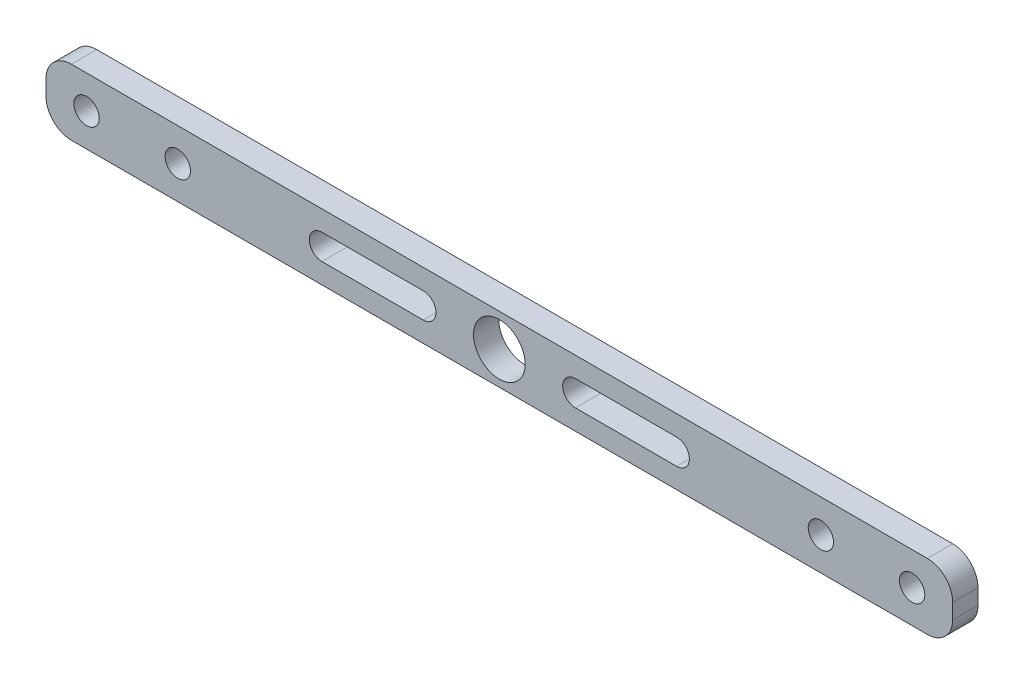
ISO-10303-21;
HEADER;
FILE_DESCRIPTION(('STEP AP214'),'2;1');
FILE_NAME('part.step','',(''),(''),'','','');
FILE_SCHEMA(('AUTOMOTIVE_DESIGN { 1 0 10303 214 1 1 1 1 }'));
ENDSEC;
DATA;
#1=APPLICATION_CONTEXT('core data for automotive mechanical design processes');
#2=APPLICATION_PROTOCOL_DEFINITION('international standard','automotive_design',2000,#1);
#3=PRODUCT_CONTEXT('',#1,'mechanical');
#4=PRODUCT('Part','Part','',(#3));
#5=PRODUCT_RELATED_PRODUCT_CATEGORY('part','',(#4));
#6=PRODUCT_DEFINITION_FORMATION('','',#4);
#7=PRODUCT_DEFINITION_CONTEXT('part definition',#1,'design');
#8=PRODUCT_DEFINITION('design','',#6,#7);
#9=PRODUCT_DEFINITION_SHAPE('','',#8);
#10=(LENGTH_UNIT() NAMED_UNIT(*) SI_UNIT(.MILLI.,.METRE.));
#11=(NAMED_UNIT(*) PLANE_ANGLE_UNIT() SI_UNIT($,.RADIAN.));
#12=(NAMED_UNIT(*) SI_UNIT($,.STERADIAN.) SOLID_ANGLE_UNIT());
#13=UNCERTAINTY_MEASURE_WITH_UNIT(LENGTH_MEASURE(1.E-05),#10,'distance_accuracy_value','');
#14=(GEOMETRIC_REPRESENTATION_CONTEXT(3) GLOBAL_UNCERTAINTY_ASSIGNED_CONTEXT((#13)) GLOBAL_UNIT_ASSIGNED_CONTEXT((#10,
#11,#12)) REPRESENTATION_CONTEXT('',''));
#15=CARTESIAN_POINT('',(0.,0.,0.));
#16=DIRECTION('',(0.,0.,1.));
#17=DIRECTION('',(1.,0.,0.));
#18=AXIS2_PLACEMENT_3D('',#15,#16,#17);
#19=CARTESIAN_POINT('',(84.445,1.5,5.));
#20=DIRECTION('',(0.,0.,-1.));
#21=DIRECTION('',(-1.,0.,0.));
#22=AXIS2_PLACEMENT_3D('',#19,#20,#21);
#23=PLANE('',#22);
#24=CARTESIAN_POINT('',(-81.445,0.,5.));
#25=DIRECTION('',(0.,0.,1.));
#26=DIRECTION('',(1.,0.,0.));
#27=AXIS2_PLACEMENT_3D('',#24,#25,#26);
#28=CIRCLE('',#27,2.49999999999999);
#29=CARTESIAN_POINT('',(-78.945,0.,5.));
#30=VERTEX_POINT('',#29);
#31=EDGE_CURVE('E203',#30,#30,#28,.T.);
#32=ORIENTED_EDGE('',*,*,#31,.F.);
#33=EDGE_LOOP('',(#32));
#34=FACE_BOUND('',#33,.T.);
#35=DIRECTION('',(-1.,0.,0.));
#36=VECTOR('',#35,1.);
#37=CARTESIAN_POINT('',(-15.,2.5,5.));
#38=LINE('',#37,#36);
#39=CARTESIAN_POINT('',(-15.,2.5,5.));
#40=VERTEX_POINT('',#39);
#41=CARTESIAN_POINT('',(-35.,2.5,5.));
#42=VERTEX_POINT('',#41);
#43=EDGE_CURVE('E173',#40,#42,#38,.T.);
#44=ORIENTED_EDGE('',*,*,#43,.F.);
#45=CARTESIAN_POINT('',(-15.,0.,5.));
#46=DIRECTION('',(0.,0.,1.));
#47=DIRECTION('',(-1.,0.,0.));
#48=AXIS2_PLACEMENT_3D('',#45,#46,#47);
#49=CIRCLE('',#48,2.5);
#50=CARTESIAN_POINT('',(-15.,-2.5,5.));
#51=VERTEX_POINT('',#50);
#52=EDGE_CURVE('E55',#51,#40,#49,.T.);
#53=ORIENTED_EDGE('',*,*,#52,.F.);
#54=DIRECTION('',(1.,0.,0.));
#55=VECTOR('',#54,1.);
#56=CARTESIAN_POINT('',(-15.,-2.5,5.));
#57=LINE('',#56,#55);
#58=CARTESIAN_POINT('',(-35.,-2.5,5.));
#59=VERTEX_POINT('',#58);
#60=EDGE_CURVE('E161',#59,#51,#57,.T.);
#61=ORIENTED_EDGE('',*,*,#60,.F.);
#62=CARTESIAN_POINT('',(-35.,0.,5.));
#63=DIRECTION('',(0.,0.,1.));
#64=DIRECTION('',(-1.,0.,0.));
#65=AXIS2_PLACEMENT_3D('',#62,#63,#64);
#66=CIRCLE('',#65,2.5);
#67=EDGE_CURVE('E167',#42,#59,#66,.T.);
#68=ORIENTED_EDGE('',*,*,#67,.F.);
#69=EDGE_LOOP('',(#44,#53,#61,#68));
#70=FACE_BOUND('',#69,.T.);
#71=CARTESIAN_POINT('',(-63.445,0.,5.));
#72=DIRECTION('',(0.,0.,1.));
#73=DIRECTION('',(1.,0.,0.));
#74=AXIS2_PLACEMENT_3D('',#71,#72,#73);
#75=CIRCLE('',#74,2.49999999999999);
#76=CARTESIAN_POINT('',(-60.945,0.,5.));
#77=VERTEX_POINT('',#76);
#78=EDGE_CURVE('E200',#77,#77,#75,.T.);
#79=ORIENTED_EDGE('',*,*,#78,.F.);
#80=EDGE_LOOP('',(#79));
#81=FACE_BOUND('',#80,.T.);
#82=CARTESIAN_POINT('',(63.445,0.,5.));
#83=DIRECTION('',(0.,0.,1.));
#84=DIRECTION('',(-1.,0.,0.));
#85=AXIS2_PLACEMENT_3D('',#82,#83,#84);
#86=CIRCLE('',#85,2.49999999999999);
#87=CARTESIAN_POINT('',(60.945,0.,5.));
#88=VERTEX_POINT('',#87);
#89=EDGE_CURVE('E184',#88,#88,#86,.T.);
#90=ORIENTED_EDGE('',*,*,#89,.F.);
#91=EDGE_LOOP('',(#90));
#92=FACE_BOUND('',#91,.T.);
#93=CARTESIAN_POINT('',(81.445,0.,5.));
#94=DIRECTION('',(0.,0.,1.));
#95=DIRECTION('',(-1.,0.,0.));
#96=AXIS2_PLACEMENT_3D('',#93,#94,#95);
#97=CIRCLE('',#96,2.49999999999999);
#98=CARTESIAN_POINT('',(78.945,0.,5.));
#99=VERTEX_POINT('',#98);
#100=EDGE_CURVE('E181',#99,#99,#97,.T.);
#101=ORIENTED_EDGE('',*,*,#100,.F.);
#102=EDGE_LOOP('',(#101));
#103=FACE_BOUND('',#102,.T.);
#104=DIRECTION('',(1.,0.,0.));
#105=VECTOR('',#104,1.);
#106=CARTESIAN_POINT('',(15.,-2.5,5.));
#107=LINE('',#106,#105);
#108=CARTESIAN_POINT('',(15.,-2.5,5.));
#109=VERTEX_POINT('',#108);
#110=CARTESIAN_POINT('',(35.,-2.5,5.));
#111=VERTEX_POINT('',#110);
#112=EDGE_CURVE('E196',#109,#111,#107,.T.);
#113=ORIENTED_EDGE('',*,*,#112,.F.);
#114=CARTESIAN_POINT('',(15.,0.,5.));
#115=DIRECTION('',(0.,0.,1.));
#116=DIRECTION('',(1.,0.,0.));
#117=AXIS2_PLACEMENT_3D('',#114,#115,#116);
#118=CIRCLE('',#117,2.5);
#119=CARTESIAN_POINT('',(15.,2.5,5.));
#120=VERTEX_POINT('',#119);
#121=EDGE_CURVE('E63',#120,#109,#118,.T.);
#122=ORIENTED_EDGE('',*,*,#121,.F.);
#123=DIRECTION('',(-1.,0.,0.));
#124=VECTOR('',#123,1.);
#125=CARTESIAN_POINT('',(15.,2.5,5.));
#126=LINE('',#125,#124);
#127=CARTESIAN_POINT('',(35.,2.5,5.));
#128=VERTEX_POINT('',#127);
#129=EDGE_CURVE('E187',#128,#120,#126,.T.);
#130=ORIENTED_EDGE('',*,*,#129,.F.);
#131=CARTESIAN_POINT('',(35.,0.,5.));
#132=DIRECTION('',(0.,0.,1.));
#133=DIRECTION('',(1.,0.,0.));
#134=AXIS2_PLACEMENT_3D('',#131,#132,#133);
#135=CIRCLE('',#134,2.5);
#136=EDGE_CURVE('E193',#111,#128,#135,.T.);
#137=ORIENTED_EDGE('',*,*,#136,.F.);
#138=EDGE_LOOP('',(#113,#122,#130,#137));
#139=FACE_BOUND('',#138,.T.);
#140=CARTESIAN_POINT('',(84.445,1.5,5.));
#141=DIRECTION('',(0.,0.,1.));
#142=DIRECTION('',(-1.,0.,0.));
#143=AXIS2_PLACEMENT_3D('',#140,#141,#142);
#144=CIRCLE('',#143,5.00000000000001);
#145=CARTESIAN_POINT('',(89.445,1.5,5.));
#146=VERTEX_POINT('',#145);
#147=CARTESIAN_POINT('',(84.445,6.5,5.));
#148=VERTEX_POINT('',#147);
#149=EDGE_CURVE('E213',#146,#148,#144,.T.);
#150=ORIENTED_EDGE('',*,*,#149,.T.);
#151=DIRECTION('',(-1.,0.,0.));
#152=VECTOR('',#151,1.);
#153=CARTESIAN_POINT('',(-84.445,6.5,5.));
#154=LINE('',#153,#152);
#155=CARTESIAN_POINT('',(-84.445,6.5,5.));
#156=VERTEX_POINT('',#155);
#157=EDGE_CURVE('E216',#148,#156,#154,.T.);
#158=ORIENTED_EDGE('',*,*,#157,.T.);
#159=CARTESIAN_POINT('',(-84.445,1.5,5.));
#160=DIRECTION('',(0.,0.,1.));
#161=DIRECTION('',(1.,0.,0.));
#162=AXIS2_PLACEMENT_3D('',#159,#160,#161);
#163=CIRCLE('',#162,5.);
#164=CARTESIAN_POINT('',(-89.445,1.5,5.));
#165=VERTEX_POINT('',#164);
#166=EDGE_CURVE('E219',#156,#165,#163,.T.);
#167=ORIENTED_EDGE('',*,*,#166,.T.);
#168=DIRECTION('',(0.,-1.,0.));
#169=VECTOR('',#168,1.);
#170=CARTESIAN_POINT('',(-89.445,1.5,5.));
#171=LINE('',#170,#169);
#172=CARTESIAN_POINT('',(-89.445,-1.5,5.));
#173=VERTEX_POINT('',#172);
#174=EDGE_CURVE('E221',#165,#173,#171,.T.);
#175=ORIENTED_EDGE('',*,*,#174,.T.);
#176=CARTESIAN_POINT('',(-84.445,-1.5,5.));
#177=DIRECTION('',(0.,0.,1.));
#178=DIRECTION('',(1.,0.,0.));
#179=AXIS2_PLACEMENT_3D('',#176,#177,#178);
#180=CIRCLE('',#179,5.);
#181=CARTESIAN_POINT('',(-84.445,-6.49999999999999,5.));
#182=VERTEX_POINT('',#181);
#183=EDGE_CURVE('E223',#173,#182,#180,.T.);
#184=ORIENTED_EDGE('',*,*,#183,.T.);
#185=DIRECTION('',(1.,0.,0.));
#186=VECTOR('',#185,1.);
#187=CARTESIAN_POINT('',(-84.445,-6.5,5.));
#188=LINE('',#187,#186);
#189=CARTESIAN_POINT('',(84.445,-6.5,5.));
#190=VERTEX_POINT('',#189);
#191=EDGE_CURVE('E225',#182,#190,#188,.T.);
#192=ORIENTED_EDGE('',*,*,#191,.T.);
#193=CARTESIAN_POINT('',(84.445,-1.5,5.));
#194=DIRECTION('',(0.,0.,1.));
#195=DIRECTION('',(1.,0.,0.));
#196=AXIS2_PLACEMENT_3D('',#193,#194,#195);
#197=CIRCLE('',#196,5.00000000000001);
#198=CARTESIAN_POINT('',(89.445,-1.5,5.));
#199=VERTEX_POINT('',#198);
#200=EDGE_CURVE('E227',#190,#199,#197,.T.);
#201=ORIENTED_EDGE('',*,*,#200,.T.);
#202=DIRECTION('',(0.,1.,0.));
#203=VECTOR('',#202,1.);
#204=CARTESIAN_POINT('',(89.445,1.5,5.));
#205=LINE('',#204,#203);
#206=EDGE_CURVE('E229',#199,#146,#205,.T.);
#207=ORIENTED_EDGE('',*,*,#206,.T.);
#208=EDGE_LOOP('',(#150,#158,#167,#175,#184,#192,#201,#207));
#209=FACE_BOUND('',#208,.T.);
#210=CARTESIAN_POINT('',(0.,0.,5.));
#211=DIRECTION('',(0.,0.,1.));
#212=DIRECTION('',(1.,0.,0.));
#213=AXIS2_PLACEMENT_3D('',#210,#211,#212);
#214=CIRCLE('',#213,5.0999999999999);
#215=CARTESIAN_POINT('',(5.09999999999998,0.,5.));
#216=VERTEX_POINT('',#215);
#217=EDGE_CURVE('E206',#216,#216,#214,.T.);
#218=ORIENTED_EDGE('',*,*,#217,.F.);
#219=EDGE_LOOP('',(#218));
#220=FACE_BOUND('',#219,.T.);
#221=ADVANCED_FACE('F39',(#34,#70,#81,#92,#103,#139,#209,#220),#23,.F.);
#222=CARTESIAN_POINT('',(84.445,1.5,0.));
#223=DIRECTION('',(0.,0.,-1.));
#224=DIRECTION('',(-1.,0.,0.));
#225=AXIS2_PLACEMENT_3D('',#222,#223,#224);
#226=PLANE('',#225);
#227=CARTESIAN_POINT('',(-81.445,0.,0.));
#228=DIRECTION('',(0.,0.,-1.));
#229=DIRECTION('',(-1.,0.,0.));
#230=AXIS2_PLACEMENT_3D('',#227,#228,#229);
#231=CIRCLE('',#230,2.49999999999999);
#232=CARTESIAN_POINT('',(-83.945,0.,0.));
#233=VERTEX_POINT('',#232);
#234=EDGE_CURVE('E43',#233,#233,#231,.T.);
#235=ORIENTED_EDGE('',*,*,#234,.F.);
#236=EDGE_LOOP('',(#235));
#237=FACE_BOUND('',#236,.T.);
#238=CARTESIAN_POINT('',(-15.,0.,0.));
#239=DIRECTION('',(0.,0.,-1.));
#240=DIRECTION('',(-1.,0.,0.));
#241=AXIS2_PLACEMENT_3D('',#238,#239,#240);
#242=CIRCLE('',#241,2.5);
#243=CARTESIAN_POINT('',(-15.,2.5,0.));
#244=VERTEX_POINT('',#243);
#245=CARTESIAN_POINT('',(-15.,-2.5,0.));
#246=VERTEX_POINT('',#245);
#247=EDGE_CURVE('E11',#244,#246,#242,.T.);
#248=ORIENTED_EDGE('',*,*,#247,.F.);
#249=DIRECTION('',(1.,0.,0.));
#250=VECTOR('',#249,1.);
#251=CARTESIAN_POINT('',(84.445,2.49999999999998,0.));
#252=LINE('',#251,#250);
#253=CARTESIAN_POINT('',(-35.,2.5,0.));
#254=VERTEX_POINT('',#253);
#255=EDGE_CURVE('E279',#254,#244,#252,.T.);
#256=ORIENTED_EDGE('',*,*,#255,.F.);
#257=CARTESIAN_POINT('',(-35.,0.,0.));
#258=DIRECTION('',(0.,0.,-1.));
#259=DIRECTION('',(-1.,0.,0.));
#260=AXIS2_PLACEMENT_3D('',#257,#258,#259);
#261=CIRCLE('',#260,2.5);
#262=CARTESIAN_POINT('',(-35.,-2.5,0.));
#263=VERTEX_POINT('',#262);
#264=EDGE_CURVE('E290',#263,#254,#261,.T.);
#265=ORIENTED_EDGE('',*,*,#264,.F.);
#266=DIRECTION('',(-1.,0.,0.));
#267=VECTOR('',#266,1.);
#268=CARTESIAN_POINT('',(84.445,-2.50000000000001,0.));
#269=LINE('',#268,#267);
#270=EDGE_CURVE('E48',#246,#263,#269,.T.);
#271=ORIENTED_EDGE('',*,*,#270,.F.);
#272=EDGE_LOOP('',(#248,#256,#265,#271));
#273=FACE_BOUND('',#272,.T.);
#274=CARTESIAN_POINT('',(-63.445,0.,0.));
#275=DIRECTION('',(0.,0.,-1.));
#276=DIRECTION('',(-1.,0.,0.));
#277=AXIS2_PLACEMENT_3D('',#274,#275,#276);
#278=CIRCLE('',#277,2.49999999999999);
#279=CARTESIAN_POINT('',(-65.945,0.,0.));
#280=VERTEX_POINT('',#279);
#281=EDGE_CURVE('E286',#280,#280,#278,.T.);
#282=ORIENTED_EDGE('',*,*,#281,.F.);
#283=EDGE_LOOP('',(#282));
#284=FACE_BOUND('',#283,.T.);
#285=CARTESIAN_POINT('',(63.445,0.,0.));
#286=DIRECTION('',(0.,0.,-1.));
#287=DIRECTION('',(-1.,0.,0.));
#288=AXIS2_PLACEMENT_3D('',#285,#286,#287);
#289=CIRCLE('',#288,2.49999999999999);
#290=CARTESIAN_POINT('',(60.945,0.,0.));
#291=VERTEX_POINT('',#290);
#292=EDGE_CURVE('E283',#291,#291,#289,.T.);
#293=ORIENTED_EDGE('',*,*,#292,.F.);
#294=EDGE_LOOP('',(#293));
#295=FACE_BOUND('',#294,.T.);
#296=CARTESIAN_POINT('',(81.445,0.,0.));
#297=DIRECTION('',(0.,0.,-1.));
#298=DIRECTION('',(-1.,0.,0.));
#299=AXIS2_PLACEMENT_3D('',#296,#297,#298);
#300=CIRCLE('',#299,2.49999999999999);
#301=CARTESIAN_POINT('',(78.945,0.,0.));
#302=VERTEX_POINT('',#301);
#303=EDGE_CURVE('E280',#302,#302,#300,.T.);
#304=ORIENTED_EDGE('',*,*,#303,.F.);
#305=EDGE_LOOP('',(#304));
#306=FACE_BOUND('',#305,.T.);
#307=CARTESIAN_POINT('',(15.,0.,0.));
#308=DIRECTION('',(0.,0.,-1.));
#309=DIRECTION('',(-1.,0.,0.));
#310=AXIS2_PLACEMENT_3D('',#307,#308,#309);
#311=CIRCLE('',#310,2.5);
#312=CARTESIAN_POINT('',(15.,-2.5,0.));
#313=VERTEX_POINT('',#312);
#314=CARTESIAN_POINT('',(15.,2.5,0.));
#315=VERTEX_POINT('',#314);
#316=EDGE_CURVE('E277',#313,#315,#311,.T.);
#317=ORIENTED_EDGE('',*,*,#316,.F.);
#318=DIRECTION('',(-1.,0.,0.));
#319=VECTOR('',#318,1.);
#320=CARTESIAN_POINT('',(84.445,-2.49999999999998,0.));
#321=LINE('',#320,#319);
#322=CARTESIAN_POINT('',(35.,-2.49999999999999,0.));
#323=VERTEX_POINT('',#322);
#324=EDGE_CURVE('E270',#323,#313,#321,.T.);
#325=ORIENTED_EDGE('',*,*,#324,.F.);
#326=CARTESIAN_POINT('',(35.,0.,0.));
#327=DIRECTION('',(0.,0.,-1.));
#328=DIRECTION('',(-1.,0.,0.));
#329=AXIS2_PLACEMENT_3D('',#326,#327,#328);
#330=CIRCLE('',#329,2.5);
#331=CARTESIAN_POINT('',(35.,2.5,0.));
#332=VERTEX_POINT('',#331);
#333=EDGE_CURVE('E272',#332,#323,#330,.T.);
#334=ORIENTED_EDGE('',*,*,#333,.F.);
#335=DIRECTION('',(1.,0.,0.));
#336=VECTOR('',#335,1.);
#337=CARTESIAN_POINT('',(84.445,2.50000000000001,0.));
#338=LINE('',#337,#336);
#339=EDGE_CURVE('E275',#315,#332,#338,.T.);
#340=ORIENTED_EDGE('',*,*,#339,.F.);
#341=EDGE_LOOP('',(#317,#325,#334,#340));
#342=FACE_BOUND('',#341,.T.);
#343=CARTESIAN_POINT('',(84.445,1.5,0.));
#344=DIRECTION('',(0.,0.,1.));
#345=DIRECTION('',(-1.,0.,0.));
#346=AXIS2_PLACEMENT_3D('',#343,#344,#345);
#347=CIRCLE('',#346,5.00000000000001);
#348=CARTESIAN_POINT('',(89.445,1.5,0.));
#349=VERTEX_POINT('',#348);
#350=CARTESIAN_POINT('',(84.445,6.5,0.));
#351=VERTEX_POINT('',#350);
#352=EDGE_CURVE('E209',#349,#351,#347,.T.);
#353=ORIENTED_EDGE('',*,*,#352,.F.);
#354=DIRECTION('',(0.,1.,0.));
#355=VECTOR('',#354,1.);
#356=CARTESIAN_POINT('',(89.445,1.5,0.));
#357=LINE('',#356,#355);
#358=CARTESIAN_POINT('',(89.445,-1.5,0.));
#359=VERTEX_POINT('',#358);
#360=EDGE_CURVE('E217',#359,#349,#357,.T.);
#361=ORIENTED_EDGE('',*,*,#360,.F.);
#362=CARTESIAN_POINT('',(84.445,-1.5,0.));
#363=DIRECTION('',(0.,0.,1.));
#364=DIRECTION('',(1.,0.,0.));
#365=AXIS2_PLACEMENT_3D('',#362,#363,#364);
#366=CIRCLE('',#365,5.00000000000001);
#367=CARTESIAN_POINT('',(84.445,-6.5,0.));
#368=VERTEX_POINT('',#367);
#369=EDGE_CURVE('E244',#368,#359,#366,.T.);
#370=ORIENTED_EDGE('',*,*,#369,.F.);
#371=DIRECTION('',(1.,0.,0.));
#372=VECTOR('',#371,1.);
#373=CARTESIAN_POINT('',(-84.445,-6.5,0.));
#374=LINE('',#373,#372);
#375=CARTESIAN_POINT('',(-84.445,-6.49999999999999,0.));
#376=VERTEX_POINT('',#375);
#377=EDGE_CURVE('E242',#376,#368,#374,.T.);
#378=ORIENTED_EDGE('',*,*,#377,.F.);
#379=CARTESIAN_POINT('',(-84.445,-1.5,0.));
#380=DIRECTION('',(0.,0.,1.));
#381=DIRECTION('',(1.,0.,0.));
#382=AXIS2_PLACEMENT_3D('',#379,#380,#381);
#383=CIRCLE('',#382,5.);
#384=CARTESIAN_POINT('',(-89.445,-1.5,0.));
#385=VERTEX_POINT('',#384);
#386=EDGE_CURVE('E240',#385,#376,#383,.T.);
#387=ORIENTED_EDGE('',*,*,#386,.F.);
#388=DIRECTION('',(0.,-1.,0.));
#389=VECTOR('',#388,1.);
#390=CARTESIAN_POINT('',(-89.445,1.5,0.));
#391=LINE('',#390,#389);
#392=CARTESIAN_POINT('',(-89.445,1.5,0.));
#393=VERTEX_POINT('',#392);
#394=EDGE_CURVE('E238',#393,#385,#391,.T.);
#395=ORIENTED_EDGE('',*,*,#394,.F.);
#396=CARTESIAN_POINT('',(-84.445,1.5,0.));
#397=DIRECTION('',(0.,0.,1.));
#398=DIRECTION('',(1.,0.,0.));
#399=AXIS2_PLACEMENT_3D('',#396,#397,#398);
#400=CIRCLE('',#399,5.);
#401=CARTESIAN_POINT('',(-84.445,6.5,0.));
#402=VERTEX_POINT('',#401);
#403=EDGE_CURVE('E236',#402,#393,#400,.T.);
#404=ORIENTED_EDGE('',*,*,#403,.F.);
#405=DIRECTION('',(-1.,0.,0.));
#406=VECTOR('',#405,1.);
#407=CARTESIAN_POINT('',(-84.445,6.5,0.));
#408=LINE('',#407,#406);
#409=EDGE_CURVE('E234',#351,#402,#408,.T.);
#410=ORIENTED_EDGE('',*,*,#409,.F.);
#411=EDGE_LOOP('',(#353,#361,#370,#378,#387,#395,#404,#410));
#412=FACE_BOUND('',#411,.T.);
#413=CARTESIAN_POINT('',(0.,0.,0.));
#414=DIRECTION('',(0.,0.,1.));
#415=DIRECTION('',(1.,0.,0.));
#416=AXIS2_PLACEMENT_3D('',#413,#414,#415);
#417=CIRCLE('',#416,5.0999999999999);
#418=CARTESIAN_POINT('',(5.09999999999998,0.,0.));
#419=VERTEX_POINT('',#418);
#420=EDGE_CURVE('E210',#419,#419,#417,.T.);
#421=ORIENTED_EDGE('',*,*,#420,.T.);
#422=EDGE_LOOP('',(#421));
#423=FACE_BOUND('',#422,.T.);
#424=ADVANCED_FACE('F300',(#237,#273,#284,#295,#306,#342,#412,#423),#226,.T.);
#425=CARTESIAN_POINT('',(84.445,1.5,5.));
#426=DIRECTION('',(0.,0.,-1.));
#427=DIRECTION('',(-1.,0.,0.));
#428=AXIS2_PLACEMENT_3D('',#425,#426,#427);
#429=CYLINDRICAL_SURFACE('',#428,5.00000000000001);
#430=ORIENTED_EDGE('',*,*,#352,.T.);
#431=DIRECTION('',(0.,0.,-1.));
#432=VECTOR('',#431,1.);
#433=CARTESIAN_POINT('',(84.445,6.5,5.));
#434=LINE('',#433,#432);
#435=EDGE_CURVE('E267',#148,#351,#434,.T.);
#436=ORIENTED_EDGE('',*,*,#435,.F.);
#437=ORIENTED_EDGE('',*,*,#149,.F.);
#438=DIRECTION('',(0.,0.,-1.));
#439=VECTOR('',#438,1.);
#440=CARTESIAN_POINT('',(89.445,1.5,5.));
#441=LINE('',#440,#439);
#442=EDGE_CURVE('E231',#146,#349,#441,.T.);
#443=ORIENTED_EDGE('',*,*,#442,.T.);
#444=EDGE_LOOP('',(#430,#436,#437,#443));
#445=FACE_BOUND('',#444,.T.);
#446=ADVANCED_FACE('F41',(#445),#429,.T.);
#447=CARTESIAN_POINT('',(-84.445,6.5,5.));
#448=DIRECTION('',(0.,-1.,0.));
#449=DIRECTION('',(0.,0.,-1.));
#450=AXIS2_PLACEMENT_3D('',#447,#448,#449);
#451=PLANE('',#450);
#452=ORIENTED_EDGE('',*,*,#409,.T.);
#453=DIRECTION('',(0.,0.,-1.));
#454=VECTOR('',#453,1.);
#455=CARTESIAN_POINT('',(-84.445,6.5,5.));
#456=LINE('',#455,#454);
#457=EDGE_CURVE('E264',#156,#402,#456,.T.);
#458=ORIENTED_EDGE('',*,*,#457,.F.);
#459=ORIENTED_EDGE('',*,*,#157,.F.);
#460=ORIENTED_EDGE('',*,*,#435,.T.);
#461=EDGE_LOOP('',(#452,#458,#459,#460));
#462=FACE_BOUND('',#461,.T.);
#463=ADVANCED_FACE('F346',(#462),#451,.F.);
#464=CARTESIAN_POINT('',(-84.445,1.5,5.));
#465=DIRECTION('',(0.,0.,-1.));
#466=DIRECTION('',(-1.,0.,0.));
#467=AXIS2_PLACEMENT_3D('',#464,#465,#466);
#468=CYLINDRICAL_SURFACE('',#467,5.);
#469=ORIENTED_EDGE('',*,*,#403,.T.);
#470=DIRECTION('',(0.,0.,-1.));
#471=VECTOR('',#470,1.);
#472=CARTESIAN_POINT('',(-89.445,1.5,5.));
#473=LINE('',#472,#471);
#474=EDGE_CURVE('E261',#165,#393,#473,.T.);
#475=ORIENTED_EDGE('',*,*,#474,.F.);
#476=ORIENTED_EDGE('',*,*,#166,.F.);
#477=ORIENTED_EDGE('',*,*,#457,.T.);
#478=EDGE_LOOP('',(#469,#475,#476,#477));
#479=FACE_BOUND('',#478,.T.);
#480=ADVANCED_FACE('F343',(#479),#468,.T.);
#481=CARTESIAN_POINT('',(-89.445,1.5,5.));
#482=DIRECTION('',(1.,0.,0.));
#483=DIRECTION('',(0.,0.,-1.));
#484=AXIS2_PLACEMENT_3D('',#481,#482,#483);
#485=PLANE('',#484);
#486=ORIENTED_EDGE('',*,*,#394,.T.);
#487=DIRECTION('',(0.,0.,-1.));
#488=VECTOR('',#487,1.);
#489=CARTESIAN_POINT('',(-89.445,-1.5,5.));
#490=LINE('',#489,#488);
#491=EDGE_CURVE('E258',#173,#385,#490,.T.);
#492=ORIENTED_EDGE('',*,*,#491,.F.);
#493=ORIENTED_EDGE('',*,*,#174,.F.);
#494=ORIENTED_EDGE('',*,*,#474,.T.);
#495=EDGE_LOOP('',(#486,#492,#493,#494));
#496=FACE_BOUND('',#495,.T.);
#497=ADVANCED_FACE('F339',(#496),#485,.F.);
#498=CARTESIAN_POINT('',(-84.445,-1.5,5.));
#499=DIRECTION('',(0.,0.,-1.));
#500=DIRECTION('',(-1.,0.,0.));
#501=AXIS2_PLACEMENT_3D('',#498,#499,#500);
#502=CYLINDRICAL_SURFACE('',#501,5.);
#503=ORIENTED_EDGE('',*,*,#386,.T.);
#504=DIRECTION('',(0.,0.,-1.));
#505=VECTOR('',#504,1.);
#506=CARTESIAN_POINT('',(-84.445,-6.49999999999999,5.));
#507=LINE('',#506,#505);
#508=EDGE_CURVE('E255',#182,#376,#507,.T.);
#509=ORIENTED_EDGE('',*,*,#508,.F.);
#510=ORIENTED_EDGE('',*,*,#183,.F.);
#511=ORIENTED_EDGE('',*,*,#491,.T.);
#512=EDGE_LOOP('',(#503,#509,#510,#511));
#513=FACE_BOUND('',#512,.T.);
#514=ADVANCED_FACE('F335',(#513),#502,.T.);
#515=CARTESIAN_POINT('',(-84.445,-6.5,5.));
#516=DIRECTION('',(0.,1.,0.));
#517=DIRECTION('',(0.,0.,1.));
#518=AXIS2_PLACEMENT_3D('',#515,#516,#517);
#519=PLANE('',#518);
#520=ORIENTED_EDGE('',*,*,#377,.T.);
#521=DIRECTION('',(0.,0.,-1.));
#522=VECTOR('',#521,1.);
#523=CARTESIAN_POINT('',(84.445,-6.5,5.));
#524=LINE('',#523,#522);
#525=EDGE_CURVE('E252',#190,#368,#524,.T.);
#526=ORIENTED_EDGE('',*,*,#525,.F.);
#527=ORIENTED_EDGE('',*,*,#191,.F.);
#528=ORIENTED_EDGE('',*,*,#508,.T.);
#529=EDGE_LOOP('',(#520,#526,#527,#528));
#530=FACE_BOUND('',#529,.T.);
#531=ADVANCED_FACE('F331',(#530),#519,.F.);
#532=CARTESIAN_POINT('',(84.445,-1.5,5.));
#533=DIRECTION('',(0.,0.,-1.));
#534=DIRECTION('',(-1.,0.,0.));
#535=AXIS2_PLACEMENT_3D('',#532,#533,#534);
#536=CYLINDRICAL_SURFACE('',#535,5.00000000000001);
#537=ORIENTED_EDGE('',*,*,#369,.T.);
#538=DIRECTION('',(0.,0.,-1.));
#539=VECTOR('',#538,1.);
#540=CARTESIAN_POINT('',(89.445,-1.5,5.));
#541=LINE('',#540,#539);
#542=EDGE_CURVE('E249',#199,#359,#541,.T.);
#543=ORIENTED_EDGE('',*,*,#542,.F.);
#544=ORIENTED_EDGE('',*,*,#200,.F.);
#545=ORIENTED_EDGE('',*,*,#525,.T.);
#546=EDGE_LOOP('',(#537,#543,#544,#545));
#547=FACE_BOUND('',#546,.T.);
#548=ADVANCED_FACE('F327',(#547),#536,.T.);
#549=CARTESIAN_POINT('',(89.445,1.5,5.));
#550=DIRECTION('',(-1.,0.,0.));
#551=DIRECTION('',(0.,0.,1.));
#552=AXIS2_PLACEMENT_3D('',#549,#550,#551);
#553=PLANE('',#552);
#554=ORIENTED_EDGE('',*,*,#360,.T.);
#555=ORIENTED_EDGE('',*,*,#442,.F.);
#556=ORIENTED_EDGE('',*,*,#206,.F.);
#557=ORIENTED_EDGE('',*,*,#542,.T.);
#558=EDGE_LOOP('',(#554,#555,#556,#557));
#559=FACE_BOUND('',#558,.T.);
#560=ADVANCED_FACE('F324',(#559),#553,.F.);
#561=CARTESIAN_POINT('',(0.,0.,5.));
#562=DIRECTION('',(0.,0.,-1.));
#563=DIRECTION('',(-1.,0.,0.));
#564=AXIS2_PLACEMENT_3D('',#561,#562,#563);
#565=CYLINDRICAL_SURFACE('',#564,5.0999999999999);
#566=ORIENTED_EDGE('',*,*,#217,.T.);
#567=EDGE_LOOP('',(#566));
#568=FACE_BOUND('',#567,.T.);
#569=ORIENTED_EDGE('',*,*,#420,.F.);
#570=EDGE_LOOP('',(#569));
#571=FACE_BOUND('',#570,.T.);
#572=ADVANCED_FACE('F321',(#568,#571),#565,.F.);
#573=CARTESIAN_POINT('',(15.,0.,-30.));
#574=DIRECTION('',(0.,0.,1.));
#575=DIRECTION('',(1.,0.,0.));
#576=AXIS2_PLACEMENT_3D('',#573,#574,#575);
#577=CYLINDRICAL_SURFACE('',#576,2.5);
#578=ORIENTED_EDGE('',*,*,#316,.T.);
#579=DIRECTION('',(0.,0.,1.));
#580=VECTOR('',#579,1.);
#581=CARTESIAN_POINT('',(15.,2.5,-30.));
#582=LINE('',#581,#580);
#583=EDGE_CURVE('E174',#315,#120,#582,.T.);
#584=ORIENTED_EDGE('',*,*,#583,.T.);
#585=ORIENTED_EDGE('',*,*,#121,.T.);
#586=DIRECTION('',(0.,0.,1.));
#587=VECTOR('',#586,1.);
#588=CARTESIAN_POINT('',(15.,-2.5,-30.));
#589=LINE('',#588,#587);
#590=EDGE_CURVE('E185',#313,#109,#589,.T.);
#591=ORIENTED_EDGE('',*,*,#590,.F.);
#592=EDGE_LOOP('',(#578,#584,#585,#591));
#593=FACE_BOUND('',#592,.T.);
#594=ADVANCED_FACE('F383',(#593),#577,.F.);
#595=CARTESIAN_POINT('',(15.,2.5,-30.));
#596=DIRECTION('',(0.,1.,0.));
#597=DIRECTION('',(-1.,0.,0.));
#598=AXIS2_PLACEMENT_3D('',#595,#596,#597);
#599=PLANE('',#598);
#600=ORIENTED_EDGE('',*,*,#339,.T.);
#601=DIRECTION('',(0.,0.,1.));
#602=VECTOR('',#601,1.);
#603=CARTESIAN_POINT('',(35.,2.5,-30.));
#604=LINE('',#603,#602);
#605=EDGE_CURVE('E176',#332,#128,#604,.T.);
#606=ORIENTED_EDGE('',*,*,#605,.T.);
#607=ORIENTED_EDGE('',*,*,#129,.T.);
#608=ORIENTED_EDGE('',*,*,#583,.F.);
#609=EDGE_LOOP('',(#600,#606,#607,#608));
#610=FACE_BOUND('',#609,.T.);
#611=ADVANCED_FACE('F388',(#610),#599,.F.);
#612=CARTESIAN_POINT('',(35.,0.,-30.));
#613=DIRECTION('',(0.,0.,1.));
#614=DIRECTION('',(1.,0.,0.));
#615=AXIS2_PLACEMENT_3D('',#612,#613,#614);
#616=CYLINDRICAL_SURFACE('',#615,2.5);
#617=ORIENTED_EDGE('',*,*,#333,.T.);
#618=DIRECTION('',(0.,0.,1.));
#619=VECTOR('',#618,1.);
#620=CARTESIAN_POINT('',(35.,-2.5,-30.));
#621=LINE('',#620,#619);
#622=EDGE_CURVE('E188',#323,#111,#621,.T.);
#623=ORIENTED_EDGE('',*,*,#622,.T.);
#624=ORIENTED_EDGE('',*,*,#136,.T.);
#625=ORIENTED_EDGE('',*,*,#605,.F.);
#626=EDGE_LOOP('',(#617,#623,#624,#625));
#627=FACE_BOUND('',#626,.T.);
#628=ADVANCED_FACE('F393',(#627),#616,.F.);
#629=CARTESIAN_POINT('',(15.,-2.5,-30.));
#630=DIRECTION('',(0.,-1.,0.));
#631=DIRECTION('',(1.,0.,0.));
#632=AXIS2_PLACEMENT_3D('',#629,#630,#631);
#633=PLANE('',#632);
#634=ORIENTED_EDGE('',*,*,#324,.T.);
#635=ORIENTED_EDGE('',*,*,#590,.T.);
#636=ORIENTED_EDGE('',*,*,#112,.T.);
#637=ORIENTED_EDGE('',*,*,#622,.F.);
#638=EDGE_LOOP('',(#634,#635,#636,#637));
#639=FACE_BOUND('',#638,.T.);
#640=ADVANCED_FACE('F400',(#639),#633,.F.);
#641=CARTESIAN_POINT('',(81.445,0.,-30.));
#642=DIRECTION('',(0.,0.,1.));
#643=DIRECTION('',(1.,0.,0.));
#644=AXIS2_PLACEMENT_3D('',#641,#642,#643);
#645=CYLINDRICAL_SURFACE('',#644,2.49999999999999);
#646=ORIENTED_EDGE('',*,*,#303,.T.);
#647=EDGE_LOOP('',(#646));
#648=FACE_BOUND('',#647,.T.);
#649=ORIENTED_EDGE('',*,*,#100,.T.);
#650=EDGE_LOOP('',(#649));
#651=FACE_BOUND('',#650,.T.);
#652=ADVANCED_FACE('F398',(#648,#651),#645,.F.);
#653=CARTESIAN_POINT('',(63.445,0.,-30.));
#654=DIRECTION('',(0.,0.,1.));
#655=DIRECTION('',(1.,0.,0.));
#656=AXIS2_PLACEMENT_3D('',#653,#654,#655);
#657=CYLINDRICAL_SURFACE('',#656,2.49999999999999);
#658=ORIENTED_EDGE('',*,*,#292,.T.);
#659=EDGE_LOOP('',(#658));
#660=FACE_BOUND('',#659,.T.);
#661=ORIENTED_EDGE('',*,*,#89,.T.);
#662=EDGE_LOOP('',(#661));
#663=FACE_BOUND('',#662,.T.);
#664=ADVANCED_FACE('F409',(#660,#663),#657,.F.);
#665=CARTESIAN_POINT('',(-63.445,0.,-30.));
#666=DIRECTION('',(0.,0.,1.));
#667=DIRECTION('',(1.,0.,0.));
#668=AXIS2_PLACEMENT_3D('',#665,#666,#667);
#669=CYLINDRICAL_SURFACE('',#668,2.49999999999999);
#670=ORIENTED_EDGE('',*,*,#281,.T.);
#671=EDGE_LOOP('',(#670));
#672=FACE_BOUND('',#671,.T.);
#673=ORIENTED_EDGE('',*,*,#78,.T.);
#674=EDGE_LOOP('',(#673));
#675=FACE_BOUND('',#674,.T.);
#676=ADVANCED_FACE('F407',(#672,#675),#669,.F.);
#677=CARTESIAN_POINT('',(-15.,0.,-30.));
#678=DIRECTION('',(0.,0.,1.));
#679=DIRECTION('',(1.,0.,0.));
#680=AXIS2_PLACEMENT_3D('',#677,#678,#679);
#681=CYLINDRICAL_SURFACE('',#680,2.5);
#682=ORIENTED_EDGE('',*,*,#247,.T.);
#683=DIRECTION('',(0.,0.,1.));
#684=VECTOR('',#683,1.);
#685=CARTESIAN_POINT('',(-15.,-2.5,-30.));
#686=LINE('',#685,#684);
#687=EDGE_CURVE('E152',#246,#51,#686,.T.);
#688=ORIENTED_EDGE('',*,*,#687,.T.);
#689=ORIENTED_EDGE('',*,*,#52,.T.);
#690=DIRECTION('',(0.,0.,1.));
#691=VECTOR('',#690,1.);
#692=CARTESIAN_POINT('',(-15.,2.5,-30.));
#693=LINE('',#692,#691);
#694=EDGE_CURVE('E168',#244,#40,#693,.T.);
#695=ORIENTED_EDGE('',*,*,#694,.F.);
#696=EDGE_LOOP('',(#682,#688,#689,#695));
#697=FACE_BOUND('',#696,.T.);
#698=ADVANCED_FACE('F154',(#697),#681,.F.);
#699=CARTESIAN_POINT('',(-15.,-2.5,-30.));
#700=DIRECTION('',(0.,-1.,0.));
#701=DIRECTION('',(1.,0.,0.));
#702=AXIS2_PLACEMENT_3D('',#699,#700,#701);
#703=PLANE('',#702);
#704=ORIENTED_EDGE('',*,*,#270,.T.);
#705=DIRECTION('',(0.,0.,1.));
#706=VECTOR('',#705,1.);
#707=CARTESIAN_POINT('',(-35.,-2.5,-30.));
#708=LINE('',#707,#706);
#709=EDGE_CURVE('E158',#263,#59,#708,.T.);
#710=ORIENTED_EDGE('',*,*,#709,.T.);
#711=ORIENTED_EDGE('',*,*,#60,.T.);
#712=ORIENTED_EDGE('',*,*,#687,.F.);
#713=EDGE_LOOP('',(#704,#710,#711,#712));
#714=FACE_BOUND('',#713,.T.);
#715=ADVANCED_FACE('F162',(#714),#703,.F.);
#716=CARTESIAN_POINT('',(-35.,0.,-30.));
#717=DIRECTION('',(0.,0.,1.));
#718=DIRECTION('',(1.,0.,0.));
#719=AXIS2_PLACEMENT_3D('',#716,#717,#718);
#720=CYLINDRICAL_SURFACE('',#719,2.5);
#721=ORIENTED_EDGE('',*,*,#264,.T.);
#722=DIRECTION('',(0.,0.,1.));
#723=VECTOR('',#722,1.);
#724=CARTESIAN_POINT('',(-35.,2.5,-30.));
#725=LINE('',#724,#723);
#726=EDGE_CURVE('E298',#254,#42,#725,.T.);
#727=ORIENTED_EDGE('',*,*,#726,.T.);
#728=ORIENTED_EDGE('',*,*,#67,.T.);
#729=ORIENTED_EDGE('',*,*,#709,.F.);
#730=EDGE_LOOP('',(#721,#727,#728,#729));
#731=FACE_BOUND('',#730,.T.);
#732=ADVANCED_FACE('F296',(#731),#720,.F.);
#733=CARTESIAN_POINT('',(-15.,2.5,-30.));
#734=DIRECTION('',(0.,1.,0.));
#735=DIRECTION('',(-1.,0.,0.));
#736=AXIS2_PLACEMENT_3D('',#733,#734,#735);
#737=PLANE('',#736);
#738=ORIENTED_EDGE('',*,*,#255,.T.);
#739=ORIENTED_EDGE('',*,*,#694,.T.);
#740=ORIENTED_EDGE('',*,*,#43,.T.);
#741=ORIENTED_EDGE('',*,*,#726,.F.);
#742=EDGE_LOOP('',(#738,#739,#740,#741));
#743=FACE_BOUND('',#742,.T.);
#744=ADVANCED_FACE('F303',(#743),#737,.F.);
#745=CARTESIAN_POINT('',(-81.445,0.,-30.));
#746=DIRECTION('',(0.,0.,1.));
#747=DIRECTION('',(1.,0.,0.));
#748=AXIS2_PLACEMENT_3D('',#745,#746,#747);
#749=CYLINDRICAL_SURFACE('',#748,2.49999999999999);
#750=ORIENTED_EDGE('',*,*,#234,.T.);
#751=EDGE_LOOP('',(#750));
#752=FACE_BOUND('',#751,.T.);
#753=ORIENTED_EDGE('',*,*,#31,.T.);
#754=EDGE_LOOP('',(#753));
#755=FACE_BOUND('',#754,.T.);
#756=ADVANCED_FACE('F310',(#752,#755),#749,.F.);
#757=CLOSED_SHELL('',(#221,#424,#446,#463,#480,#497,#514,#531,#548,#560,#572,#594,#611,#628,
#640,#652,#664,#676,#698,#715,#732,#744,#756));
#758=MANIFOLD_SOLID_BREP('B2',#757);
#759=ADVANCED_BREP_SHAPE_REPRESENTATION('',(#18,#758),#14);
#760=SHAPE_DEFINITION_REPRESENTATION(#9,#759);
ENDSEC;
END-ISO-10303-21;
